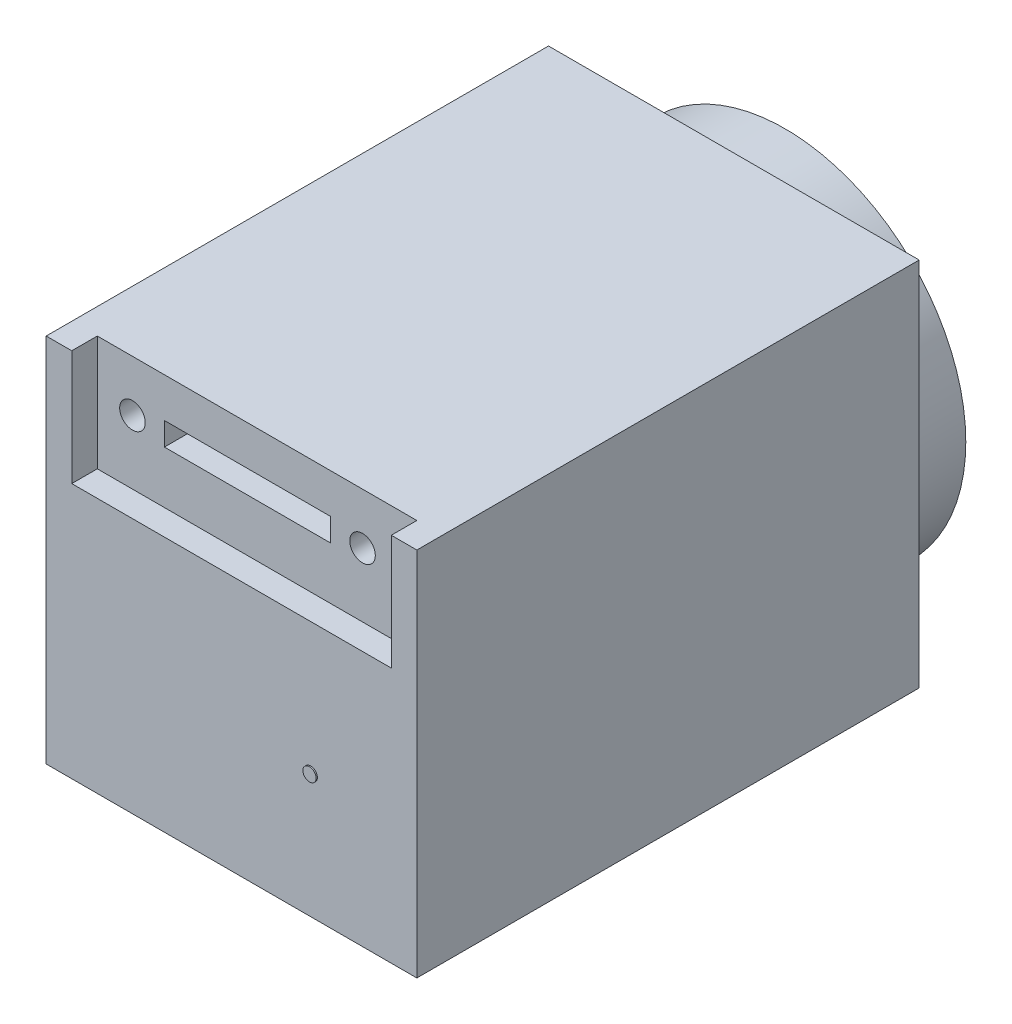
ISO-10303-21;
HEADER;
FILE_DESCRIPTION(('STEP AP214'),'2;1');
FILE_NAME('part.step','',(''),(''),'','','');
FILE_SCHEMA(('AUTOMOTIVE_DESIGN { 1 0 10303 214 1 1 1 1 }'));
ENDSEC;
DATA;
#1=APPLICATION_CONTEXT('core data for automotive mechanical design processes');
#2=APPLICATION_PROTOCOL_DEFINITION('international standard','automotive_design',2000,#1);
#3=PRODUCT_CONTEXT('',#1,'mechanical');
#4=PRODUCT('Part','Part','',(#3));
#5=PRODUCT_RELATED_PRODUCT_CATEGORY('part','',(#4));
#6=PRODUCT_DEFINITION_FORMATION('','',#4);
#7=PRODUCT_DEFINITION_CONTEXT('part definition',#1,'design');
#8=PRODUCT_DEFINITION('design','',#6,#7);
#9=PRODUCT_DEFINITION_SHAPE('','',#8);
#10=(LENGTH_UNIT() NAMED_UNIT(*) SI_UNIT(.MILLI.,.METRE.));
#11=(NAMED_UNIT(*) PLANE_ANGLE_UNIT() SI_UNIT($,.RADIAN.));
#12=(NAMED_UNIT(*) SI_UNIT($,.STERADIAN.) SOLID_ANGLE_UNIT());
#13=UNCERTAINTY_MEASURE_WITH_UNIT(LENGTH_MEASURE(1.E-05),#10,'distance_accuracy_value','');
#14=(GEOMETRIC_REPRESENTATION_CONTEXT(3) GLOBAL_UNCERTAINTY_ASSIGNED_CONTEXT((#13)) GLOBAL_UNIT_ASSIGNED_CONTEXT((#10,
#11,#12)) REPRESENTATION_CONTEXT('',''));
#15=CARTESIAN_POINT('',(0.,0.,0.));
#16=DIRECTION('',(0.,0.,1.));
#17=DIRECTION('',(1.,0.,0.));
#18=AXIS2_PLACEMENT_3D('',#15,#16,#17);
#19=CARTESIAN_POINT('',(-38.1246105919003,18.1588785046729,39.3));
#20=DIRECTION('',(1.,0.,0.));
#21=DIRECTION('',(0.,1.,0.));
#22=AXIS2_PLACEMENT_3D('',#19,#20,#21);
#23=PLANE('',#22);
#24=DIRECTION('',(0.,-1.,0.));
#25=VECTOR('',#24,1.);
#26=CARTESIAN_POINT('',(-38.1246105919003,18.1588785046729,0.));
#27=LINE('',#26,#25);
#28=CARTESIAN_POINT('',(-38.1246105919003,18.1588785046729,0.));
#29=VERTEX_POINT('',#28);
#30=CARTESIAN_POINT('',(-38.1246105919003,-10.8411214953271,0.));
#31=VERTEX_POINT('',#30);
#32=EDGE_CURVE('E232',#29,#31,#27,.T.);
#33=ORIENTED_EDGE('',*,*,#32,.T.);
#34=DIRECTION('',(0.,0.,-1.));
#35=VECTOR('',#34,1.);
#36=CARTESIAN_POINT('',(-38.1246105919003,-10.8411214953271,39.3));
#37=LINE('',#36,#35);
#38=CARTESIAN_POINT('',(-38.1246105919003,-10.8411214953271,39.3));
#39=VERTEX_POINT('',#38);
#40=EDGE_CURVE('E50',#39,#31,#37,.T.);
#41=ORIENTED_EDGE('',*,*,#40,.F.);
#42=DIRECTION('',(0.,-1.,0.));
#43=VECTOR('',#42,1.);
#44=CARTESIAN_POINT('',(-38.1246105919003,18.1588785046729,39.3));
#45=LINE('',#44,#43);
#46=CARTESIAN_POINT('',(-38.1246105919003,18.1588785046729,39.3));
#47=VERTEX_POINT('',#46);
#48=EDGE_CURVE('E233',#47,#39,#45,.T.);
#49=ORIENTED_EDGE('',*,*,#48,.F.);
#50=DIRECTION('',(0.,0.,-1.));
#51=VECTOR('',#50,1.);
#52=CARTESIAN_POINT('',(-38.1246105919003,18.1588785046729,39.3));
#53=LINE('',#52,#51);
#54=EDGE_CURVE('E249',#47,#29,#53,.T.);
#55=ORIENTED_EDGE('',*,*,#54,.T.);
#56=EDGE_LOOP('',(#33,#41,#49,#55));
#57=FACE_BOUND('',#56,.T.);
#58=ADVANCED_FACE('F42',(#57),#23,.F.);
#59=CARTESIAN_POINT('',(-38.1246105919003,-10.8411214953271,39.3));
#60=DIRECTION('',(0.,1.,0.));
#61=DIRECTION('',(0.,0.,1.));
#62=AXIS2_PLACEMENT_3D('',#59,#60,#61);
#63=PLANE('',#62);
#64=CARTESIAN_POINT('',(-23.4172501018206,-10.8411214953271,19.3689907841334));
#65=DIRECTION('',(0.,-1.,0.));
#66=DIRECTION('',(0.,0.,-1.));
#67=AXIS2_PLACEMENT_3D('',#64,#65,#66);
#68=CIRCLE('',#67,3.);
#69=CARTESIAN_POINT('',(-23.4172501018206,-10.8411214953271,16.3689907841333));
#70=VERTEX_POINT('',#69);
#71=EDGE_CURVE('E639',#70,#70,#68,.T.);
#72=ORIENTED_EDGE('',*,*,#71,.F.);
#73=EDGE_LOOP('',(#72));
#74=FACE_BOUND('',#73,.T.);
#75=DIRECTION('',(1.,0.,0.));
#76=VECTOR('',#75,1.);
#77=CARTESIAN_POINT('',(-38.1246105919003,-10.8411214953271,0.));
#78=LINE('',#77,#76);
#79=CARTESIAN_POINT('',(-9.12461059190031,-10.8411214953271,0.));
#80=VERTEX_POINT('',#79);
#81=EDGE_CURVE('E253',#31,#80,#78,.T.);
#82=ORIENTED_EDGE('',*,*,#81,.T.);
#83=DIRECTION('',(0.,0.,-1.));
#84=VECTOR('',#83,1.);
#85=CARTESIAN_POINT('',(-9.12461059190031,-10.8411214953271,39.3));
#86=LINE('',#85,#84);
#87=CARTESIAN_POINT('',(-9.12461059190031,-10.8411214953271,39.3));
#88=VERTEX_POINT('',#87);
#89=EDGE_CURVE('E268',#88,#80,#86,.T.);
#90=ORIENTED_EDGE('',*,*,#89,.F.);
#91=DIRECTION('',(1.,0.,0.));
#92=VECTOR('',#91,1.);
#93=CARTESIAN_POINT('',(-38.1246105919003,-10.8411214953271,39.3));
#94=LINE('',#93,#92);
#95=EDGE_CURVE('E237',#39,#88,#94,.T.);
#96=ORIENTED_EDGE('',*,*,#95,.F.);
#97=ORIENTED_EDGE('',*,*,#40,.T.);
#98=EDGE_LOOP('',(#82,#90,#96,#97));
#99=FACE_BOUND('',#98,.T.);
#100=ADVANCED_FACE('F275',(#74,#99),#63,.F.);
#101=CARTESIAN_POINT('',(-9.12461059190032,18.1588785046729,39.3));
#102=DIRECTION('',(-1.,0.,0.));
#103=DIRECTION('',(0.,-1.,0.));
#104=AXIS2_PLACEMENT_3D('',#101,#102,#103);
#105=PLANE('',#104);
#106=DIRECTION('',(0.,1.,0.));
#107=VECTOR('',#106,1.);
#108=CARTESIAN_POINT('',(-9.12461059190032,18.1588785046729,0.));
#109=LINE('',#108,#107);
#110=CARTESIAN_POINT('',(-9.12461059190032,18.1588785046729,0.));
#111=VERTEX_POINT('',#110);
#112=EDGE_CURVE('E256',#80,#111,#109,.T.);
#113=ORIENTED_EDGE('',*,*,#112,.T.);
#114=DIRECTION('',(0.,0.,-1.));
#115=VECTOR('',#114,1.);
#116=CARTESIAN_POINT('',(-9.12461059190032,18.1588785046729,39.3));
#117=LINE('',#116,#115);
#118=CARTESIAN_POINT('',(-9.12461059190032,18.1588785046729,39.3));
#119=VERTEX_POINT('',#118);
#120=EDGE_CURVE('E264',#119,#111,#117,.T.);
#121=ORIENTED_EDGE('',*,*,#120,.F.);
#122=DIRECTION('',(0.,1.,0.));
#123=VECTOR('',#122,1.);
#124=CARTESIAN_POINT('',(-9.12461059190032,18.1588785046729,39.3));
#125=LINE('',#124,#123);
#126=EDGE_CURVE('E241',#88,#119,#125,.T.);
#127=ORIENTED_EDGE('',*,*,#126,.F.);
#128=ORIENTED_EDGE('',*,*,#89,.T.);
#129=EDGE_LOOP('',(#113,#121,#127,#128));
#130=FACE_BOUND('',#129,.T.);
#131=ADVANCED_FACE('F287',(#130),#105,.F.);
#132=CARTESIAN_POINT('',(-38.1246105919003,18.1588785046729,39.3));
#133=DIRECTION('',(0.,-1.,0.));
#134=DIRECTION('',(0.,0.,-1.));
#135=AXIS2_PLACEMENT_3D('',#132,#133,#134);
#136=PLANE('',#135);
#137=DIRECTION('',(-1.,0.,0.));
#138=VECTOR('',#137,1.);
#139=CARTESIAN_POINT('',(-11.1246105919003,18.1588785046729,37.3));
#140=LINE('',#139,#138);
#141=CARTESIAN_POINT('',(-11.1246105919003,18.1588785046729,37.3));
#142=VERTEX_POINT('',#141);
#143=CARTESIAN_POINT('',(-36.1246105919003,18.1588785046729,37.3));
#144=VERTEX_POINT('',#143);
#145=EDGE_CURVE('E185',#142,#144,#140,.T.);
#146=ORIENTED_EDGE('',*,*,#145,.F.);
#147=DIRECTION('',(0.,0.,1.));
#148=VECTOR('',#147,1.);
#149=CARTESIAN_POINT('',(-11.1246105919003,18.1588785046729,37.3));
#150=LINE('',#149,#148);
#151=CARTESIAN_POINT('',(-11.1246105919003,18.1588785046729,39.3));
#152=VERTEX_POINT('',#151);
#153=EDGE_CURVE('E198',#142,#152,#150,.T.);
#154=ORIENTED_EDGE('',*,*,#153,.T.);
#155=DIRECTION('',(-1.,0.,0.));
#156=VECTOR('',#155,1.);
#157=CARTESIAN_POINT('',(-38.1246105919003,18.1588785046729,39.3));
#158=LINE('',#157,#156);
#159=EDGE_CURVE('E245',#119,#152,#158,.T.);
#160=ORIENTED_EDGE('',*,*,#159,.F.);
#161=ORIENTED_EDGE('',*,*,#120,.T.);
#162=DIRECTION('',(-1.,0.,0.));
#163=VECTOR('',#162,1.);
#164=CARTESIAN_POINT('',(-38.1246105919003,18.1588785046729,0.));
#165=LINE('',#164,#163);
#166=EDGE_CURVE('E238',#111,#29,#165,.T.);
#167=ORIENTED_EDGE('',*,*,#166,.T.);
#168=ORIENTED_EDGE('',*,*,#54,.F.);
#169=CARTESIAN_POINT('',(-36.1246105919003,18.1588785046729,39.3));
#170=VERTEX_POINT('',#169);
#171=EDGE_CURVE('E244',#170,#47,#158,.T.);
#172=ORIENTED_EDGE('',*,*,#171,.F.);
#173=DIRECTION('',(0.,0.,1.));
#174=VECTOR('',#173,1.);
#175=CARTESIAN_POINT('',(-36.1246105919003,18.1588785046729,37.3));
#176=LINE('',#175,#174);
#177=EDGE_CURVE('E65',#144,#170,#176,.T.);
#178=ORIENTED_EDGE('',*,*,#177,.F.);
#179=EDGE_LOOP('',(#146,#154,#160,#161,#167,#168,#172,#178));
#180=FACE_BOUND('',#179,.T.);
#181=ADVANCED_FACE('F292',(#180),#136,.F.);
#182=CARTESIAN_POINT('',(0.,0.,39.3));
#183=DIRECTION('',(0.,0.,1.));
#184=DIRECTION('',(1.,0.,0.));
#185=AXIS2_PLACEMENT_3D('',#182,#183,#184);
#186=PLANE('',#185);
#187=CARTESIAN_POINT('',(-17.4246105919003,-1.14112149532711,39.3));
#188=DIRECTION('',(0.,0.,1.));
#189=DIRECTION('',(1.,0.,0.));
#190=AXIS2_PLACEMENT_3D('',#187,#188,#189);
#191=CIRCLE('',#190,0.517544676059372);
#192=CARTESIAN_POINT('',(-16.9070659158409,-1.14112149532711,39.3));
#193=VERTEX_POINT('',#192);
#194=EDGE_CURVE('E638',#193,#193,#191,.T.);
#195=ORIENTED_EDGE('',*,*,#194,.F.);
#196=EDGE_LOOP('',(#195));
#197=FACE_BOUND('',#196,.T.);
#198=DIRECTION('',(0.,1.,0.));
#199=VECTOR('',#198,1.);
#200=CARTESIAN_POINT('',(-11.1246105919003,18.1588785046729,39.3));
#201=LINE('',#200,#199);
#202=CARTESIAN_POINT('',(-11.1246105919003,9.1588785046729,39.3));
#203=VERTEX_POINT('',#202);
#204=EDGE_CURVE('E199',#203,#152,#201,.T.);
#205=ORIENTED_EDGE('',*,*,#204,.F.);
#206=DIRECTION('',(1.,0.,0.));
#207=VECTOR('',#206,1.);
#208=CARTESIAN_POINT('',(-11.1246105919003,9.1588785046729,39.3));
#209=LINE('',#208,#207);
#210=CARTESIAN_POINT('',(-36.1246105919003,9.15887850467289,39.3));
#211=VERTEX_POINT('',#210);
#212=EDGE_CURVE('E186',#211,#203,#209,.T.);
#213=ORIENTED_EDGE('',*,*,#212,.F.);
#214=DIRECTION('',(0.,-1.,0.));
#215=VECTOR('',#214,1.);
#216=CARTESIAN_POINT('',(-36.1246105919003,18.1588785046729,39.3));
#217=LINE('',#216,#215);
#218=EDGE_CURVE('E202',#170,#211,#217,.T.);
#219=ORIENTED_EDGE('',*,*,#218,.F.);
#220=ORIENTED_EDGE('',*,*,#171,.T.);
#221=ORIENTED_EDGE('',*,*,#48,.T.);
#222=ORIENTED_EDGE('',*,*,#95,.T.);
#223=ORIENTED_EDGE('',*,*,#126,.T.);
#224=ORIENTED_EDGE('',*,*,#159,.T.);
#225=EDGE_LOOP('',(#205,#213,#219,#220,#221,#222,#223,#224));
#226=FACE_BOUND('',#225,.T.);
#227=ADVANCED_FACE('F295',(#197,#226),#186,.T.);
#228=CARTESIAN_POINT('',(0.,0.,0.));
#229=DIRECTION('',(0.,0.,1.));
#230=DIRECTION('',(1.,0.,0.));
#231=AXIS2_PLACEMENT_3D('',#228,#229,#230);
#232=PLANE('',#231);
#233=CARTESIAN_POINT('',(-23.6246105919003,3.6588785046729,0.));
#234=DIRECTION('',(0.,0.,1.));
#235=DIRECTION('',(1.,0.,0.));
#236=AXIS2_PLACEMENT_3D('',#233,#234,#235);
#237=CIRCLE('',#236,14.15);
#238=CARTESIAN_POINT('',(-9.47461059190031,3.6588785046729,0.));
#239=VERTEX_POINT('',#238);
#240=EDGE_CURVE('E11',#239,#239,#237,.F.);
#241=ORIENTED_EDGE('',*,*,#240,.F.);
#242=EDGE_LOOP('',(#241));
#243=FACE_BOUND('',#242,.T.);
#244=ORIENTED_EDGE('',*,*,#32,.F.);
#245=ORIENTED_EDGE('',*,*,#166,.F.);
#246=ORIENTED_EDGE('',*,*,#112,.F.);
#247=ORIENTED_EDGE('',*,*,#81,.F.);
#248=EDGE_LOOP('',(#244,#245,#246,#247));
#249=FACE_BOUND('',#248,.T.);
#250=ADVANCED_FACE('F283',(#243,#249),#232,.F.);
#251=CARTESIAN_POINT('',(-23.6246105919003,3.6588785046729,-4.));
#252=DIRECTION('',(0.,0.,-1.));
#253=DIRECTION('',(-1.,0.,0.));
#254=AXIS2_PLACEMENT_3D('',#251,#252,#253);
#255=PLANE('',#254);
#256=CARTESIAN_POINT('',(-23.6246105919003,3.6588785046729,-4.));
#257=DIRECTION('',(0.,0.,-1.));
#258=DIRECTION('',(-1.,0.,0.));
#259=AXIS2_PLACEMENT_3D('',#256,#257,#258);
#260=CIRCLE('',#259,14.15);
#261=CARTESIAN_POINT('',(-37.7746105919003,3.6588785046729,-4.));
#262=VERTEX_POINT('',#261);
#263=EDGE_CURVE('E225',#262,#262,#260,.T.);
#264=ORIENTED_EDGE('',*,*,#263,.T.);
#265=EDGE_LOOP('',(#264));
#266=FACE_BOUND('',#265,.T.);
#267=CARTESIAN_POINT('',(-23.6246105919003,3.6588785046729,-4.));
#268=DIRECTION('',(0.,0.,-1.));
#269=DIRECTION('',(-1.,0.,0.));
#270=AXIS2_PLACEMENT_3D('',#267,#268,#269);
#271=CIRCLE('',#270,12.7);
#272=CARTESIAN_POINT('',(-36.3246105919003,3.6588785046729,-4.));
#273=VERTEX_POINT('',#272);
#274=EDGE_CURVE('E221',#273,#273,#271,.T.);
#275=ORIENTED_EDGE('',*,*,#274,.F.);
#276=EDGE_LOOP('',(#275));
#277=FACE_BOUND('',#276,.T.);
#278=ADVANCED_FACE('F355',(#266,#277),#255,.T.);
#279=CARTESIAN_POINT('',(-23.6246105919003,3.6588785046729,-4.));
#280=DIRECTION('',(0.,0.,1.));
#281=DIRECTION('',(1.,0.,0.));
#282=AXIS2_PLACEMENT_3D('',#279,#280,#281);
#283=CYLINDRICAL_SURFACE('',#282,14.15);
#284=ORIENTED_EDGE('',*,*,#263,.F.);
#285=EDGE_LOOP('',(#284));
#286=FACE_BOUND('',#285,.T.);
#287=ORIENTED_EDGE('',*,*,#240,.T.);
#288=EDGE_LOOP('',(#287));
#289=FACE_BOUND('',#288,.T.);
#290=ADVANCED_FACE('F361',(#286,#289),#283,.T.);
#291=CARTESIAN_POINT('',(-23.6246105919003,3.6588785046729,-4.));
#292=DIRECTION('',(0.,0.,1.));
#293=DIRECTION('',(1.,0.,0.));
#294=AXIS2_PLACEMENT_3D('',#291,#292,#293);
#295=CYLINDRICAL_SURFACE('',#294,12.7);
#296=ORIENTED_EDGE('',*,*,#274,.T.);
#297=EDGE_LOOP('',(#296));
#298=FACE_BOUND('',#297,.T.);
#299=CARTESIAN_POINT('',(-23.6246105919003,3.6588785046729,0.));
#300=DIRECTION('',(0.,0.,-1.));
#301=DIRECTION('',(-1.,0.,0.));
#302=AXIS2_PLACEMENT_3D('',#299,#300,#301);
#303=CIRCLE('',#302,12.7);
#304=CARTESIAN_POINT('',(-36.3246105919003,3.6588785046729,0.));
#305=VERTEX_POINT('',#304);
#306=EDGE_CURVE('E212',#305,#305,#303,.T.);
#307=ORIENTED_EDGE('',*,*,#306,.F.);
#308=EDGE_LOOP('',(#307));
#309=FACE_BOUND('',#308,.T.);
#310=ADVANCED_FACE('F364',(#298,#309),#295,.F.);
#311=ORIENTED_EDGE('',*,*,#306,.T.);
#312=EDGE_LOOP('',(#311));
#313=FACE_BOUND('',#312,.T.);
#314=ADVANCED_FACE('F357',(#313),#232,.F.);
#315=CARTESIAN_POINT('',(-11.1246105919003,18.1588785046729,37.3));
#316=DIRECTION('',(1.,0.,0.));
#317=DIRECTION('',(0.,1.,0.));
#318=AXIS2_PLACEMENT_3D('',#315,#316,#317);
#319=PLANE('',#318);
#320=ORIENTED_EDGE('',*,*,#204,.T.);
#321=ORIENTED_EDGE('',*,*,#153,.F.);
#322=DIRECTION('',(0.,1.,0.));
#323=VECTOR('',#322,1.);
#324=CARTESIAN_POINT('',(-11.1246105919003,18.1588785046729,37.3));
#325=LINE('',#324,#323);
#326=CARTESIAN_POINT('',(-11.1246105919003,9.1588785046729,37.3));
#327=VERTEX_POINT('',#326);
#328=EDGE_CURVE('E181',#327,#142,#325,.T.);
#329=ORIENTED_EDGE('',*,*,#328,.F.);
#330=DIRECTION('',(0.,0.,1.));
#331=VECTOR('',#330,1.);
#332=CARTESIAN_POINT('',(-11.1246105919003,9.1588785046729,37.3));
#333=LINE('',#332,#331);
#334=EDGE_CURVE('E209',#327,#203,#333,.T.);
#335=ORIENTED_EDGE('',*,*,#334,.T.);
#336=EDGE_LOOP('',(#320,#321,#329,#335));
#337=FACE_BOUND('',#336,.T.);
#338=ADVANCED_FACE('F372',(#337),#319,.F.);
#339=CARTESIAN_POINT('',(-11.1246105919003,9.1588785046729,37.3));
#340=DIRECTION('',(0.,-1.,0.));
#341=DIRECTION('',(1.,0.,0.));
#342=AXIS2_PLACEMENT_3D('',#339,#340,#341);
#343=PLANE('',#342);
#344=ORIENTED_EDGE('',*,*,#212,.T.);
#345=ORIENTED_EDGE('',*,*,#334,.F.);
#346=DIRECTION('',(1.,0.,0.));
#347=VECTOR('',#346,1.);
#348=CARTESIAN_POINT('',(-11.1246105919003,9.1588785046729,37.3));
#349=LINE('',#348,#347);
#350=CARTESIAN_POINT('',(-36.1246105919003,9.15887850467289,37.3));
#351=VERTEX_POINT('',#350);
#352=EDGE_CURVE('E194',#351,#327,#349,.T.);
#353=ORIENTED_EDGE('',*,*,#352,.F.);
#354=DIRECTION('',(0.,0.,1.));
#355=VECTOR('',#354,1.);
#356=CARTESIAN_POINT('',(-36.1246105919003,9.15887850467289,37.3));
#357=LINE('',#356,#355);
#358=EDGE_CURVE('E213',#351,#211,#357,.T.);
#359=ORIENTED_EDGE('',*,*,#358,.T.);
#360=EDGE_LOOP('',(#344,#345,#353,#359));
#361=FACE_BOUND('',#360,.T.);
#362=ADVANCED_FACE('F375',(#361),#343,.F.);
#363=CARTESIAN_POINT('',(-36.1246105919003,18.1588785046729,37.3));
#364=DIRECTION('',(-1.,0.,0.));
#365=DIRECTION('',(0.,0.,1.));
#366=AXIS2_PLACEMENT_3D('',#363,#364,#365);
#367=PLANE('',#366);
#368=ORIENTED_EDGE('',*,*,#218,.T.);
#369=ORIENTED_EDGE('',*,*,#358,.F.);
#370=DIRECTION('',(0.,-1.,0.));
#371=VECTOR('',#370,1.);
#372=CARTESIAN_POINT('',(-36.1246105919003,18.1588785046729,37.3));
#373=LINE('',#372,#371);
#374=EDGE_CURVE('E190',#144,#351,#373,.T.);
#375=ORIENTED_EDGE('',*,*,#374,.F.);
#376=ORIENTED_EDGE('',*,*,#177,.T.);
#377=EDGE_LOOP('',(#368,#369,#375,#376));
#378=FACE_BOUND('',#377,.T.);
#379=ADVANCED_FACE('F377',(#378),#367,.F.);
#380=CARTESIAN_POINT('',(0.,0.,37.3));
#381=DIRECTION('',(0.,0.,-1.));
#382=DIRECTION('',(-1.,0.,0.));
#383=AXIS2_PLACEMENT_3D('',#380,#381,#382);
#384=PLANE('',#383);
#385=CARTESIAN_POINT('',(-33.3746105919003,14.1588785046729,37.3));
#386=DIRECTION('',(0.,0.,1.));
#387=DIRECTION('',(1.,0.,0.));
#388=AXIS2_PLACEMENT_3D('',#385,#386,#387);
#389=CIRCLE('',#388,0.999999999999998);
#390=CARTESIAN_POINT('',(-32.3746105919003,14.1588785046729,37.3));
#391=VERTEX_POINT('',#390);
#392=EDGE_CURVE('E302',#391,#391,#389,.T.);
#393=ORIENTED_EDGE('',*,*,#392,.F.);
#394=EDGE_LOOP('',(#393));
#395=FACE_BOUND('',#394,.T.);
#396=CARTESIAN_POINT('',(-15.3746105919003,14.1588785046729,37.3));
#397=DIRECTION('',(0.,0.,1.));
#398=DIRECTION('',(1.,0.,0.));
#399=AXIS2_PLACEMENT_3D('',#396,#397,#398);
#400=CIRCLE('',#399,1.);
#401=CARTESIAN_POINT('',(-14.3746105919003,14.1588785046729,37.3));
#402=VERTEX_POINT('',#401);
#403=EDGE_CURVE('E162',#402,#402,#400,.T.);
#404=ORIENTED_EDGE('',*,*,#403,.F.);
#405=EDGE_LOOP('',(#404));
#406=FACE_BOUND('',#405,.T.);
#407=DIRECTION('',(1.,0.,0.));
#408=VECTOR('',#407,1.);
#409=CARTESIAN_POINT('',(-30.8746105919003,13.2588785046729,37.3));
#410=LINE('',#409,#408);
#411=CARTESIAN_POINT('',(-30.8746105919003,13.2588785046729,37.3));
#412=VERTEX_POINT('',#411);
#413=CARTESIAN_POINT('',(-17.8746105919003,13.2588785046729,37.3));
#414=VERTEX_POINT('',#413);
#415=EDGE_CURVE('E155',#412,#414,#410,.T.);
#416=ORIENTED_EDGE('',*,*,#415,.F.);
#417=DIRECTION('',(0.,-1.,0.));
#418=VECTOR('',#417,1.);
#419=CARTESIAN_POINT('',(-30.8746105919003,15.0588785046729,37.3));
#420=LINE('',#419,#418);
#421=CARTESIAN_POINT('',(-30.8746105919003,15.0588785046729,37.3));
#422=VERTEX_POINT('',#421);
#423=EDGE_CURVE('E57',#422,#412,#420,.T.);
#424=ORIENTED_EDGE('',*,*,#423,.F.);
#425=DIRECTION('',(-1.,0.,0.));
#426=VECTOR('',#425,1.);
#427=CARTESIAN_POINT('',(-30.8746105919003,15.0588785046729,37.3));
#428=LINE('',#427,#426);
#429=CARTESIAN_POINT('',(-17.8746105919003,15.0588785046729,37.3));
#430=VERTEX_POINT('',#429);
#431=EDGE_CURVE('E143',#430,#422,#428,.T.);
#432=ORIENTED_EDGE('',*,*,#431,.F.);
#433=DIRECTION('',(0.,1.,0.));
#434=VECTOR('',#433,1.);
#435=CARTESIAN_POINT('',(-17.8746105919003,15.0588785046729,37.3));
#436=LINE('',#435,#434);
#437=EDGE_CURVE('E149',#414,#430,#436,.T.);
#438=ORIENTED_EDGE('',*,*,#437,.F.);
#439=EDGE_LOOP('',(#416,#424,#432,#438));
#440=FACE_BOUND('',#439,.T.);
#441=ORIENTED_EDGE('',*,*,#328,.T.);
#442=ORIENTED_EDGE('',*,*,#145,.T.);
#443=ORIENTED_EDGE('',*,*,#374,.T.);
#444=ORIENTED_EDGE('',*,*,#352,.T.);
#445=EDGE_LOOP('',(#441,#442,#443,#444));
#446=FACE_BOUND('',#445,.T.);
#447=ADVANCED_FACE('F152',(#395,#406,#440,#446),#384,.F.);
#448=CARTESIAN_POINT('',(-30.8746105919003,15.0588785046729,32.3));
#449=DIRECTION('',(-1.,0.,0.));
#450=DIRECTION('',(0.,0.,1.));
#451=AXIS2_PLACEMENT_3D('',#448,#449,#450);
#452=PLANE('',#451);
#453=ORIENTED_EDGE('',*,*,#423,.T.);
#454=DIRECTION('',(0.,0.,1.));
#455=VECTOR('',#454,1.);
#456=CARTESIAN_POINT('',(-30.8746105919003,13.2588785046729,32.3));
#457=LINE('',#456,#455);
#458=CARTESIAN_POINT('',(-30.8746105919003,13.2588785046729,32.3));
#459=VERTEX_POINT('',#458);
#460=EDGE_CURVE('E171',#459,#412,#457,.T.);
#461=ORIENTED_EDGE('',*,*,#460,.F.);
#462=DIRECTION('',(0.,-1.,0.));
#463=VECTOR('',#462,1.);
#464=CARTESIAN_POINT('',(-30.8746105919003,15.0588785046729,32.3));
#465=LINE('',#464,#463);
#466=CARTESIAN_POINT('',(-30.8746105919003,15.0588785046729,32.3));
#467=VERTEX_POINT('',#466);
#468=EDGE_CURVE('E134',#467,#459,#465,.T.);
#469=ORIENTED_EDGE('',*,*,#468,.F.);
#470=DIRECTION('',(0.,0.,1.));
#471=VECTOR('',#470,1.);
#472=CARTESIAN_POINT('',(-30.8746105919003,15.0588785046729,32.3));
#473=LINE('',#472,#471);
#474=EDGE_CURVE('E130',#467,#422,#473,.T.);
#475=ORIENTED_EDGE('',*,*,#474,.T.);
#476=EDGE_LOOP('',(#453,#461,#469,#475));
#477=FACE_BOUND('',#476,.T.);
#478=ADVANCED_FACE('F132',(#477),#452,.F.);
#479=CARTESIAN_POINT('',(-30.8746105919003,15.0588785046729,32.3));
#480=DIRECTION('',(0.,1.,0.));
#481=DIRECTION('',(0.,0.,1.));
#482=AXIS2_PLACEMENT_3D('',#479,#480,#481);
#483=PLANE('',#482);
#484=ORIENTED_EDGE('',*,*,#431,.T.);
#485=ORIENTED_EDGE('',*,*,#474,.F.);
#486=DIRECTION('',(-1.,0.,0.));
#487=VECTOR('',#486,1.);
#488=CARTESIAN_POINT('',(-30.8746105919003,15.0588785046729,32.3));
#489=LINE('',#488,#487);
#490=CARTESIAN_POINT('',(-17.8746105919003,15.0588785046729,32.3));
#491=VERTEX_POINT('',#490);
#492=EDGE_CURVE('E167',#491,#467,#489,.T.);
#493=ORIENTED_EDGE('',*,*,#492,.F.);
#494=DIRECTION('',(0.,0.,1.));
#495=VECTOR('',#494,1.);
#496=CARTESIAN_POINT('',(-17.8746105919003,15.0588785046729,32.3));
#497=LINE('',#496,#495);
#498=EDGE_CURVE('E139',#491,#430,#497,.T.);
#499=ORIENTED_EDGE('',*,*,#498,.T.);
#500=EDGE_LOOP('',(#484,#485,#493,#499));
#501=FACE_BOUND('',#500,.T.);
#502=ADVANCED_FACE('F144',(#501),#483,.F.);
#503=CARTESIAN_POINT('',(-17.8746105919003,15.0588785046729,32.3));
#504=DIRECTION('',(1.,0.,0.));
#505=DIRECTION('',(0.,0.,-1.));
#506=AXIS2_PLACEMENT_3D('',#503,#504,#505);
#507=PLANE('',#506);
#508=ORIENTED_EDGE('',*,*,#437,.T.);
#509=ORIENTED_EDGE('',*,*,#498,.F.);
#510=DIRECTION('',(0.,1.,0.));
#511=VECTOR('',#510,1.);
#512=CARTESIAN_POINT('',(-17.8746105919003,15.0588785046729,32.3));
#513=LINE('',#512,#511);
#514=CARTESIAN_POINT('',(-17.8746105919003,13.2588785046729,32.3));
#515=VERTEX_POINT('',#514);
#516=EDGE_CURVE('E170',#515,#491,#513,.T.);
#517=ORIENTED_EDGE('',*,*,#516,.F.);
#518=DIRECTION('',(0.,0.,1.));
#519=VECTOR('',#518,1.);
#520=CARTESIAN_POINT('',(-17.8746105919003,13.2588785046729,32.3));
#521=LINE('',#520,#519);
#522=EDGE_CURVE('E314',#515,#414,#521,.T.);
#523=ORIENTED_EDGE('',*,*,#522,.T.);
#524=EDGE_LOOP('',(#508,#509,#517,#523));
#525=FACE_BOUND('',#524,.T.);
#526=ADVANCED_FACE('F320',(#525),#507,.F.);
#527=CARTESIAN_POINT('',(-30.8746105919003,13.2588785046729,32.3));
#528=DIRECTION('',(0.,-1.,0.));
#529=DIRECTION('',(1.,0.,0.));
#530=AXIS2_PLACEMENT_3D('',#527,#528,#529);
#531=PLANE('',#530);
#532=ORIENTED_EDGE('',*,*,#415,.T.);
#533=ORIENTED_EDGE('',*,*,#522,.F.);
#534=DIRECTION('',(1.,0.,0.));
#535=VECTOR('',#534,1.);
#536=CARTESIAN_POINT('',(-30.8746105919003,13.2588785046729,32.3));
#537=LINE('',#536,#535);
#538=EDGE_CURVE('E175',#459,#515,#537,.T.);
#539=ORIENTED_EDGE('',*,*,#538,.F.);
#540=ORIENTED_EDGE('',*,*,#460,.T.);
#541=EDGE_LOOP('',(#532,#533,#539,#540));
#542=FACE_BOUND('',#541,.T.);
#543=ADVANCED_FACE('F324',(#542),#531,.F.);
#544=CARTESIAN_POINT('',(0.,0.,32.3));
#545=DIRECTION('',(0.,0.,1.));
#546=DIRECTION('',(1.,0.,0.));
#547=AXIS2_PLACEMENT_3D('',#544,#545,#546);
#548=PLANE('',#547);
#549=ORIENTED_EDGE('',*,*,#468,.T.);
#550=ORIENTED_EDGE('',*,*,#538,.T.);
#551=ORIENTED_EDGE('',*,*,#516,.T.);
#552=ORIENTED_EDGE('',*,*,#492,.T.);
#553=EDGE_LOOP('',(#549,#550,#551,#552));
#554=FACE_BOUND('',#553,.T.);
#555=ADVANCED_FACE('F326',(#554),#548,.T.);
#556=CARTESIAN_POINT('',(-15.3746105919003,14.1588785046729,32.3));
#557=DIRECTION('',(0.,0.,1.));
#558=DIRECTION('',(1.,0.,0.));
#559=AXIS2_PLACEMENT_3D('',#556,#557,#558);
#560=CYLINDRICAL_SURFACE('',#559,1.);
#561=CARTESIAN_POINT('',(-15.3746105919003,14.1588785046729,32.3));
#562=DIRECTION('',(0.,0.,1.));
#563=DIRECTION('',(1.,0.,0.));
#564=AXIS2_PLACEMENT_3D('',#561,#562,#563);
#565=CIRCLE('',#564,1.);
#566=CARTESIAN_POINT('',(-14.3746105919003,14.1588785046729,32.3));
#567=VERTEX_POINT('',#566);
#568=EDGE_CURVE('E157',#567,#567,#565,.T.);
#569=ORIENTED_EDGE('',*,*,#568,.F.);
#570=EDGE_LOOP('',(#569));
#571=FACE_BOUND('',#570,.T.);
#572=ORIENTED_EDGE('',*,*,#403,.T.);
#573=EDGE_LOOP('',(#572));
#574=FACE_BOUND('',#573,.T.);
#575=ADVANCED_FACE('F328',(#571,#574),#560,.F.);
#576=CARTESIAN_POINT('',(-15.3746105919003,14.1588785046729,32.3));
#577=DIRECTION('',(0.,0.,1.));
#578=DIRECTION('',(1.,0.,0.));
#579=AXIS2_PLACEMENT_3D('',#576,#577,#578);
#580=PLANE('',#579);
#581=ORIENTED_EDGE('',*,*,#568,.T.);
#582=EDGE_LOOP('',(#581));
#583=FACE_BOUND('',#582,.T.);
#584=ADVANCED_FACE('F334',(#583),#580,.T.);
#585=CARTESIAN_POINT('',(-33.3746105919003,14.1588785046729,32.3));
#586=DIRECTION('',(0.,0.,1.));
#587=DIRECTION('',(1.,0.,0.));
#588=AXIS2_PLACEMENT_3D('',#585,#586,#587);
#589=CYLINDRICAL_SURFACE('',#588,0.999999999999998);
#590=CARTESIAN_POINT('',(-33.3746105919003,14.1588785046729,32.3));
#591=DIRECTION('',(0.,0.,1.));
#592=DIRECTION('',(1.,0.,0.));
#593=AXIS2_PLACEMENT_3D('',#590,#591,#592);
#594=CIRCLE('',#593,0.999999999999998);
#595=CARTESIAN_POINT('',(-32.3746105919003,14.1588785046729,32.3));
#596=VERTEX_POINT('',#595);
#597=EDGE_CURVE('E203',#596,#596,#594,.T.);
#598=ORIENTED_EDGE('',*,*,#597,.F.);
#599=EDGE_LOOP('',(#598));
#600=FACE_BOUND('',#599,.T.);
#601=ORIENTED_EDGE('',*,*,#392,.T.);
#602=EDGE_LOOP('',(#601));
#603=FACE_BOUND('',#602,.T.);
#604=ADVANCED_FACE('F391',(#600,#603),#589,.F.);
#605=CARTESIAN_POINT('',(-33.3746105919003,14.1588785046729,32.3));
#606=DIRECTION('',(0.,0.,1.));
#607=DIRECTION('',(1.,0.,0.));
#608=AXIS2_PLACEMENT_3D('',#605,#606,#607);
#609=PLANE('',#608);
#610=ORIENTED_EDGE('',*,*,#597,.T.);
#611=EDGE_LOOP('',(#610));
#612=FACE_BOUND('',#611,.T.);
#613=ADVANCED_FACE('F393',(#612),#609,.T.);
#614=CARTESIAN_POINT('',(-17.4246105919003,-1.14112149532711,39.4));
#615=DIRECTION('',(0.,0.,-1.));
#616=DIRECTION('',(-1.,0.,0.));
#617=AXIS2_PLACEMENT_3D('',#614,#615,#616);
#618=CYLINDRICAL_SURFACE('',#617,0.517544676059372);
#619=CARTESIAN_POINT('',(-17.4246105919003,-1.14112149532711,39.4));
#620=DIRECTION('',(0.,0.,1.));
#621=DIRECTION('',(1.,0.,0.));
#622=AXIS2_PLACEMENT_3D('',#619,#620,#621);
#623=CIRCLE('',#622,0.517544676059372);
#624=CARTESIAN_POINT('',(-16.9070659158409,-1.14112149532711,39.4));
#625=VERTEX_POINT('',#624);
#626=EDGE_CURVE('E140',#625,#625,#623,.T.);
#627=ORIENTED_EDGE('',*,*,#626,.F.);
#628=EDGE_LOOP('',(#627));
#629=FACE_BOUND('',#628,.T.);
#630=ORIENTED_EDGE('',*,*,#194,.T.);
#631=EDGE_LOOP('',(#630));
#632=FACE_BOUND('',#631,.T.);
#633=ADVANCED_FACE('F400',(#629,#632),#618,.T.);
#634=CARTESIAN_POINT('',(-17.4246105919003,-1.14112149532711,39.4));
#635=DIRECTION('',(0.,0.,1.));
#636=DIRECTION('',(1.,0.,0.));
#637=AXIS2_PLACEMENT_3D('',#634,#635,#636);
#638=PLANE('',#637);
#639=ORIENTED_EDGE('',*,*,#626,.T.);
#640=EDGE_LOOP('',(#639));
#641=FACE_BOUND('',#640,.T.);
#642=ADVANCED_FACE('F472',(#641),#638,.T.);
#643=CARTESIAN_POINT('',(-23.4172501018206,-3.8411214953271,19.3689907841334));
#644=DIRECTION('',(0.,-1.,0.));
#645=DIRECTION('',(0.,0.,-1.));
#646=AXIS2_PLACEMENT_3D('',#643,#644,#645);
#647=CYLINDRICAL_SURFACE('',#646,3.);
#648=CARTESIAN_POINT('',(-23.4172501018206,-3.8411214953271,19.3689907841334));
#649=DIRECTION('',(0.,-1.,0.));
#650=DIRECTION('',(0.,0.,-1.));
#651=AXIS2_PLACEMENT_3D('',#648,#649,#650);
#652=CIRCLE('',#651,3.);
#653=CARTESIAN_POINT('',(-23.4172501018206,-3.8411214953271,16.3689907841333));
#654=VERTEX_POINT('',#653);
#655=EDGE_CURVE('E636',#654,#654,#652,.T.);
#656=ORIENTED_EDGE('',*,*,#655,.F.);
#657=EDGE_LOOP('',(#656));
#658=FACE_BOUND('',#657,.T.);
#659=ORIENTED_EDGE('',*,*,#71,.T.);
#660=EDGE_LOOP('',(#659));
#661=FACE_BOUND('',#660,.T.);
#662=ADVANCED_FACE('F481',(#658,#661),#647,.F.);
#663=CARTESIAN_POINT('',(-23.4172501018206,-3.8411214953271,19.3689907841334));
#664=DIRECTION('',(0.,-1.,0.));
#665=DIRECTION('',(0.,0.,-1.));
#666=AXIS2_PLACEMENT_3D('',#663,#664,#665);
#667=PLANE('',#666);
#668=ORIENTED_EDGE('',*,*,#655,.T.);
#669=EDGE_LOOP('',(#668));
#670=FACE_BOUND('',#669,.T.);
#671=ADVANCED_FACE('F500',(#670),#667,.T.);
#672=CLOSED_SHELL('',(#58,#100,#131,#181,#227,#250,#278,#290,#310,#314,#338,#362,#379,#447,#478,
#502,#526,#543,#555,#575,#584,#604,#613,#633,#642,#662,#671));
#673=MANIFOLD_SOLID_BREP('B2',#672);
#674=ADVANCED_BREP_SHAPE_REPRESENTATION('',(#18,#673),#14);
#675=SHAPE_DEFINITION_REPRESENTATION(#9,#674);
ENDSEC;
END-ISO-10303-21;
